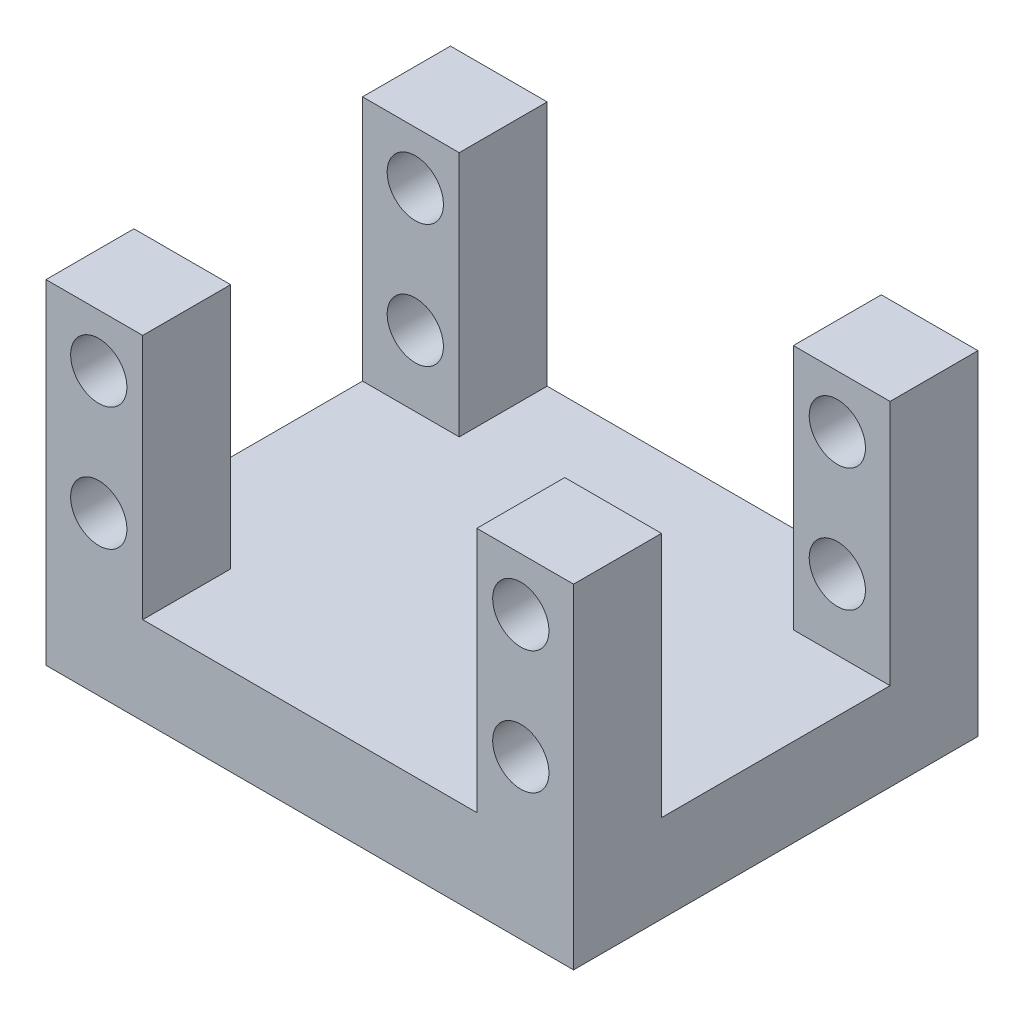
ISO-10303-21;
HEADER;
FILE_DESCRIPTION(('STEP AP214'),'2;1');
FILE_NAME('part.step','',(''),(''),'','','');
FILE_SCHEMA(('AUTOMOTIVE_DESIGN { 1 0 10303 214 1 1 1 1 }'));
ENDSEC;
DATA;
#1=APPLICATION_CONTEXT('core data for automotive mechanical design processes');
#2=APPLICATION_PROTOCOL_DEFINITION('international standard','automotive_design',2000,#1);
#3=PRODUCT_CONTEXT('',#1,'mechanical');
#4=PRODUCT('Part','Part','',(#3));
#5=PRODUCT_RELATED_PRODUCT_CATEGORY('part','',(#4));
#6=PRODUCT_DEFINITION_FORMATION('','',#4);
#7=PRODUCT_DEFINITION_CONTEXT('part definition',#1,'design');
#8=PRODUCT_DEFINITION('design','',#6,#7);
#9=PRODUCT_DEFINITION_SHAPE('','',#8);
#10=(LENGTH_UNIT() NAMED_UNIT(*) SI_UNIT(.MILLI.,.METRE.));
#11=(NAMED_UNIT(*) PLANE_ANGLE_UNIT() SI_UNIT($,.RADIAN.));
#12=(NAMED_UNIT(*) SI_UNIT($,.STERADIAN.) SOLID_ANGLE_UNIT());
#13=UNCERTAINTY_MEASURE_WITH_UNIT(LENGTH_MEASURE(1.E-05),#10,'distance_accuracy_value','');
#14=(GEOMETRIC_REPRESENTATION_CONTEXT(3) GLOBAL_UNCERTAINTY_ASSIGNED_CONTEXT((#13)) GLOBAL_UNIT_ASSIGNED_CONTEXT((#10,
#11,#12)) REPRESENTATION_CONTEXT('',''));
#15=CARTESIAN_POINT('',(0.,0.,0.));
#16=DIRECTION('',(0.,0.,1.));
#17=DIRECTION('',(1.,0.,0.));
#18=AXIS2_PLACEMENT_3D('',#15,#16,#17);
#19=CARTESIAN_POINT('',(9.50000000000002,9.5,23.));
#20=DIRECTION('',(0.,-1.,0.));
#21=DIRECTION('',(1.,0.,0.));
#22=AXIS2_PLACEMENT_3D('',#19,#20,#21);
#23=PLANE('',#22);
#24=DIRECTION('',(0.,0.,-1.));
#25=VECTOR('',#24,1.);
#26=CARTESIAN_POINT('',(9.50000000000002,9.5,23.));
#27=LINE('',#26,#25);
#28=CARTESIAN_POINT('',(9.50000000000002,9.5,5.));
#29=VERTEX_POINT('',#28);
#30=CARTESIAN_POINT('',(9.50000000000002,9.5,0.));
#31=VERTEX_POINT('',#30);
#32=EDGE_CURVE('E49',#29,#31,#27,.T.);
#33=ORIENTED_EDGE('',*,*,#32,.F.);
#34=DIRECTION('',(1.,0.,0.));
#35=VECTOR('',#34,1.);
#36=CARTESIAN_POINT('',(-15.,9.5,5.));
#37=LINE('',#36,#35);
#38=CARTESIAN_POINT('',(15.,9.5,5.));
#39=VERTEX_POINT('',#38);
#40=EDGE_CURVE('E167',#29,#39,#37,.T.);
#41=ORIENTED_EDGE('',*,*,#40,.T.);
#42=DIRECTION('',(0.,0.,-1.));
#43=VECTOR('',#42,1.);
#44=CARTESIAN_POINT('',(15.,9.5,23.));
#45=LINE('',#44,#43);
#46=CARTESIAN_POINT('',(15.,9.5,0.));
#47=VERTEX_POINT('',#46);
#48=EDGE_CURVE('E325',#39,#47,#45,.T.);
#49=ORIENTED_EDGE('',*,*,#48,.T.);
#50=DIRECTION('',(-1.,0.,0.));
#51=VECTOR('',#50,1.);
#52=CARTESIAN_POINT('',(9.50000000000002,9.5,0.));
#53=LINE('',#52,#51);
#54=EDGE_CURVE('E298',#47,#31,#53,.T.);
#55=ORIENTED_EDGE('',*,*,#54,.T.);
#56=EDGE_LOOP('',(#33,#41,#49,#55));
#57=FACE_BOUND('',#56,.T.);
#58=ADVANCED_FACE('F39',(#57),#23,.F.);
#59=CARTESIAN_POINT('',(9.50000000000002,-4.5,23.));
#60=DIRECTION('',(1.,0.,0.));
#61=DIRECTION('',(0.,0.,-1.));
#62=AXIS2_PLACEMENT_3D('',#59,#60,#61);
#63=PLANE('',#62);
#64=DIRECTION('',(0.,0.,-1.));
#65=VECTOR('',#64,1.);
#66=CARTESIAN_POINT('',(9.50000000000002,-4.5,23.));
#67=LINE('',#66,#65);
#68=CARTESIAN_POINT('',(9.50000000000001,-4.5,5.));
#69=VERTEX_POINT('',#68);
#70=CARTESIAN_POINT('',(9.50000000000002,-4.5,0.));
#71=VERTEX_POINT('',#70);
#72=EDGE_CURVE('E204',#69,#71,#67,.T.);
#73=ORIENTED_EDGE('',*,*,#72,.F.);
#74=DIRECTION('',(0.,1.,0.));
#75=VECTOR('',#74,1.);
#76=CARTESIAN_POINT('',(9.50000000000002,-4.5,5.));
#77=LINE('',#76,#75);
#78=EDGE_CURVE('E262',#69,#29,#77,.T.);
#79=ORIENTED_EDGE('',*,*,#78,.T.);
#80=ORIENTED_EDGE('',*,*,#32,.T.);
#81=DIRECTION('',(0.,-1.,0.));
#82=VECTOR('',#81,1.);
#83=CARTESIAN_POINT('',(9.50000000000002,-4.5,0.));
#84=LINE('',#83,#82);
#85=EDGE_CURVE('E329',#31,#71,#84,.T.);
#86=ORIENTED_EDGE('',*,*,#85,.T.);
#87=EDGE_LOOP('',(#73,#79,#80,#86));
#88=FACE_BOUND('',#87,.T.);
#89=ADVANCED_FACE('F401',(#88),#63,.F.);
#90=CARTESIAN_POINT('',(-9.49999999999998,-4.5,23.));
#91=DIRECTION('',(-1.,0.,0.));
#92=DIRECTION('',(0.,0.,1.));
#93=AXIS2_PLACEMENT_3D('',#90,#91,#92);
#94=PLANE('',#93);
#95=DIRECTION('',(0.,0.,-1.));
#96=VECTOR('',#95,1.);
#97=CARTESIAN_POINT('',(-9.49999999999998,9.5,23.));
#98=LINE('',#97,#96);
#99=CARTESIAN_POINT('',(-9.49999999999998,9.5,5.));
#100=VERTEX_POINT('',#99);
#101=CARTESIAN_POINT('',(-9.49999999999998,9.5,0.));
#102=VERTEX_POINT('',#101);
#103=EDGE_CURVE('E189',#100,#102,#98,.T.);
#104=ORIENTED_EDGE('',*,*,#103,.F.);
#105=DIRECTION('',(0.,-1.,0.));
#106=VECTOR('',#105,1.);
#107=CARTESIAN_POINT('',(-9.49999999999998,-4.5,5.));
#108=LINE('',#107,#106);
#109=CARTESIAN_POINT('',(-9.49999999999998,-4.5,5.));
#110=VERTEX_POINT('',#109);
#111=EDGE_CURVE('E162',#100,#110,#108,.T.);
#112=ORIENTED_EDGE('',*,*,#111,.T.);
#113=DIRECTION('',(0.,0.,-1.));
#114=VECTOR('',#113,1.);
#115=CARTESIAN_POINT('',(-9.49999999999998,-4.5,23.));
#116=LINE('',#115,#114);
#117=CARTESIAN_POINT('',(-9.49999999999998,-4.5,0.));
#118=VERTEX_POINT('',#117);
#119=EDGE_CURVE('E199',#110,#118,#116,.T.);
#120=ORIENTED_EDGE('',*,*,#119,.T.);
#121=DIRECTION('',(0.,1.,0.));
#122=VECTOR('',#121,1.);
#123=CARTESIAN_POINT('',(-9.49999999999998,-4.5,0.));
#124=LINE('',#123,#122);
#125=EDGE_CURVE('E337',#118,#102,#124,.T.);
#126=ORIENTED_EDGE('',*,*,#125,.T.);
#127=EDGE_LOOP('',(#104,#112,#120,#126));
#128=FACE_BOUND('',#127,.T.);
#129=ADVANCED_FACE('F405',(#128),#94,.F.);
#130=CARTESIAN_POINT('',(-15.,9.5,23.));
#131=DIRECTION('',(0.,-1.,0.));
#132=DIRECTION('',(0.,0.,-1.));
#133=AXIS2_PLACEMENT_3D('',#130,#131,#132);
#134=PLANE('',#133);
#135=DIRECTION('',(0.,0.,-1.));
#136=VECTOR('',#135,1.);
#137=CARTESIAN_POINT('',(-15.,9.5,23.));
#138=LINE('',#137,#136);
#139=CARTESIAN_POINT('',(-15.,9.5,5.));
#140=VERTEX_POINT('',#139);
#141=CARTESIAN_POINT('',(-15.,9.5,0.));
#142=VERTEX_POINT('',#141);
#143=EDGE_CURVE('E171',#140,#142,#138,.T.);
#144=ORIENTED_EDGE('',*,*,#143,.F.);
#145=EDGE_CURVE('E157',#140,#100,#37,.T.);
#146=ORIENTED_EDGE('',*,*,#145,.T.);
#147=ORIENTED_EDGE('',*,*,#103,.T.);
#148=DIRECTION('',(-1.,0.,0.));
#149=VECTOR('',#148,1.);
#150=CARTESIAN_POINT('',(-15.,9.5,0.));
#151=LINE('',#150,#149);
#152=EDGE_CURVE('E180',#102,#142,#151,.T.);
#153=ORIENTED_EDGE('',*,*,#152,.T.);
#154=EDGE_LOOP('',(#144,#146,#147,#153));
#155=FACE_BOUND('',#154,.T.);
#156=ADVANCED_FACE('F178',(#155),#134,.F.);
#157=CARTESIAN_POINT('',(12.,6.5,0.));
#158=DIRECTION('',(0.,0.,-1.));
#159=DIRECTION('',(-1.,0.,0.));
#160=AXIS2_PLACEMENT_3D('',#157,#158,#159);
#161=CYLINDRICAL_SURFACE('',#160,1.60000000000001);
#162=CARTESIAN_POINT('',(12.,6.5,5.));
#163=DIRECTION('',(0.,0.,-1.));
#164=DIRECTION('',(-1.,0.,0.));
#165=AXIS2_PLACEMENT_3D('',#162,#163,#164);
#166=CIRCLE('',#165,1.60000000000001);
#167=CARTESIAN_POINT('',(10.4,6.5,5.));
#168=VERTEX_POINT('',#167);
#169=EDGE_CURVE('E256',#168,#168,#166,.F.);
#170=ORIENTED_EDGE('',*,*,#169,.T.);
#171=EDGE_LOOP('',(#170));
#172=FACE_BOUND('',#171,.T.);
#173=CARTESIAN_POINT('',(12.,6.5,0.));
#174=DIRECTION('',(0.,0.,-1.));
#175=DIRECTION('',(-1.,0.,0.));
#176=AXIS2_PLACEMENT_3D('',#173,#174,#175);
#177=CIRCLE('',#176,1.60000000000001);
#178=CARTESIAN_POINT('',(10.4,6.5,0.));
#179=VERTEX_POINT('',#178);
#180=EDGE_CURVE('E290',#179,#179,#177,.T.);
#181=ORIENTED_EDGE('',*,*,#180,.T.);
#182=EDGE_LOOP('',(#181));
#183=FACE_BOUND('',#182,.T.);
#184=ADVANCED_FACE('F515',(#172,#183),#161,.F.);
#185=CARTESIAN_POINT('',(12.,-0.500000000000007,0.));
#186=DIRECTION('',(0.,0.,-1.));
#187=DIRECTION('',(-1.,0.,0.));
#188=AXIS2_PLACEMENT_3D('',#185,#186,#187);
#189=CYLINDRICAL_SURFACE('',#188,1.60000000000001);
#190=CARTESIAN_POINT('',(12.,-0.500000000000007,5.));
#191=DIRECTION('',(0.,0.,-1.));
#192=DIRECTION('',(-1.,0.,0.));
#193=AXIS2_PLACEMENT_3D('',#190,#191,#192);
#194=CIRCLE('',#193,1.60000000000001);
#195=CARTESIAN_POINT('',(10.4,-0.500000000000007,5.));
#196=VERTEX_POINT('',#195);
#197=EDGE_CURVE('E252',#196,#196,#194,.F.);
#198=ORIENTED_EDGE('',*,*,#197,.T.);
#199=EDGE_LOOP('',(#198));
#200=FACE_BOUND('',#199,.T.);
#201=CARTESIAN_POINT('',(12.,-0.500000000000007,0.));
#202=DIRECTION('',(0.,0.,-1.));
#203=DIRECTION('',(-1.,0.,0.));
#204=AXIS2_PLACEMENT_3D('',#201,#202,#203);
#205=CIRCLE('',#204,1.60000000000001);
#206=CARTESIAN_POINT('',(10.4,-0.500000000000007,0.));
#207=VERTEX_POINT('',#206);
#208=EDGE_CURVE('E282',#207,#207,#205,.T.);
#209=ORIENTED_EDGE('',*,*,#208,.T.);
#210=EDGE_LOOP('',(#209));
#211=FACE_BOUND('',#210,.T.);
#212=ADVANCED_FACE('F528',(#200,#211),#189,.F.);
#213=CARTESIAN_POINT('',(-12.,-0.500000000000007,0.));
#214=DIRECTION('',(0.,0.,-1.));
#215=DIRECTION('',(-1.,0.,0.));
#216=AXIS2_PLACEMENT_3D('',#213,#214,#215);
#217=CYLINDRICAL_SURFACE('',#216,1.60000000000001);
#218=CARTESIAN_POINT('',(-12.,-0.500000000000007,5.));
#219=DIRECTION('',(0.,0.,-1.));
#220=DIRECTION('',(-1.,0.,0.));
#221=AXIS2_PLACEMENT_3D('',#218,#219,#220);
#222=CIRCLE('',#221,1.60000000000001);
#223=CARTESIAN_POINT('',(-13.6,-0.500000000000007,5.));
#224=VERTEX_POINT('',#223);
#225=EDGE_CURVE('E248',#224,#224,#222,.F.);
#226=ORIENTED_EDGE('',*,*,#225,.T.);
#227=EDGE_LOOP('',(#226));
#228=FACE_BOUND('',#227,.T.);
#229=CARTESIAN_POINT('',(-12.,-0.500000000000007,0.));
#230=DIRECTION('',(0.,0.,-1.));
#231=DIRECTION('',(-1.,0.,0.));
#232=AXIS2_PLACEMENT_3D('',#229,#230,#231);
#233=CIRCLE('',#232,1.60000000000001);
#234=CARTESIAN_POINT('',(-13.6,-0.500000000000007,0.));
#235=VERTEX_POINT('',#234);
#236=EDGE_CURVE('E274',#235,#235,#233,.T.);
#237=ORIENTED_EDGE('',*,*,#236,.T.);
#238=EDGE_LOOP('',(#237));
#239=FACE_BOUND('',#238,.T.);
#240=ADVANCED_FACE('F416',(#228,#239),#217,.F.);
#241=CARTESIAN_POINT('',(-12.,6.5,0.));
#242=DIRECTION('',(0.,0.,-1.));
#243=DIRECTION('',(-1.,0.,0.));
#244=AXIS2_PLACEMENT_3D('',#241,#242,#243);
#245=CYLINDRICAL_SURFACE('',#244,1.60000000000001);
#246=CARTESIAN_POINT('',(-12.,6.5,5.));
#247=DIRECTION('',(0.,0.,-1.));
#248=DIRECTION('',(-1.,0.,0.));
#249=AXIS2_PLACEMENT_3D('',#246,#247,#248);
#250=CIRCLE('',#249,1.60000000000001);
#251=CARTESIAN_POINT('',(-13.6,6.5,5.));
#252=VERTEX_POINT('',#251);
#253=EDGE_CURVE('E43',#252,#252,#250,.F.);
#254=ORIENTED_EDGE('',*,*,#253,.T.);
#255=EDGE_LOOP('',(#254));
#256=FACE_BOUND('',#255,.T.);
#257=CARTESIAN_POINT('',(-12.,6.5,0.));
#258=DIRECTION('',(0.,0.,-1.));
#259=DIRECTION('',(-1.,0.,0.));
#260=AXIS2_PLACEMENT_3D('',#257,#258,#259);
#261=CIRCLE('',#260,1.60000000000001);
#262=CARTESIAN_POINT('',(-13.6,6.5,0.));
#263=VERTEX_POINT('',#262);
#264=EDGE_CURVE('E266',#263,#263,#261,.T.);
#265=ORIENTED_EDGE('',*,*,#264,.T.);
#266=EDGE_LOOP('',(#265));
#267=FACE_BOUND('',#266,.T.);
#268=ADVANCED_FACE('F381',(#256,#267),#245,.F.);
#269=CARTESIAN_POINT('',(15.,9.5,23.));
#270=VERTEX_POINT('',#269);
#271=CARTESIAN_POINT('',(15.,9.5,18.));
#272=VERTEX_POINT('',#271);
#273=EDGE_CURVE('E352',#270,#272,#45,.T.);
#274=ORIENTED_EDGE('',*,*,#273,.T.);
#275=DIRECTION('',(1.,0.,0.));
#276=VECTOR('',#275,1.);
#277=CARTESIAN_POINT('',(-15.,9.5,18.));
#278=LINE('',#277,#276);
#279=CARTESIAN_POINT('',(9.50000000000002,9.5,18.));
#280=VERTEX_POINT('',#279);
#281=EDGE_CURVE('E65',#280,#272,#278,.T.);
#282=ORIENTED_EDGE('',*,*,#281,.F.);
#283=CARTESIAN_POINT('',(9.50000000000002,9.5,23.));
#284=VERTEX_POINT('',#283);
#285=EDGE_CURVE('E11',#284,#280,#27,.T.);
#286=ORIENTED_EDGE('',*,*,#285,.F.);
#287=DIRECTION('',(-1.,0.,0.));
#288=VECTOR('',#287,1.);
#289=CARTESIAN_POINT('',(9.50000000000002,9.5,23.));
#290=LINE('',#289,#288);
#291=EDGE_CURVE('E299',#270,#284,#290,.T.);
#292=ORIENTED_EDGE('',*,*,#291,.F.);
#293=EDGE_LOOP('',(#274,#282,#286,#292));
#294=FACE_BOUND('',#293,.T.);
#295=ADVANCED_FACE('F41',(#294),#23,.F.);
#296=ORIENTED_EDGE('',*,*,#285,.T.);
#297=DIRECTION('',(0.,-1.,0.));
#298=VECTOR('',#297,1.);
#299=CARTESIAN_POINT('',(9.50000000000002,-4.5,18.));
#300=LINE('',#299,#298);
#301=CARTESIAN_POINT('',(9.50000000000001,-4.5,18.));
#302=VERTEX_POINT('',#301);
#303=EDGE_CURVE('E244',#280,#302,#300,.T.);
#304=ORIENTED_EDGE('',*,*,#303,.T.);
#305=CARTESIAN_POINT('',(9.50000000000002,-4.5,23.));
#306=VERTEX_POINT('',#305);
#307=EDGE_CURVE('E205',#306,#302,#67,.T.);
#308=ORIENTED_EDGE('',*,*,#307,.F.);
#309=DIRECTION('',(0.,-1.,0.));
#310=VECTOR('',#309,1.);
#311=CARTESIAN_POINT('',(9.50000000000002,-4.5,23.));
#312=LINE('',#311,#310);
#313=EDGE_CURVE('E303',#284,#306,#312,.T.);
#314=ORIENTED_EDGE('',*,*,#313,.F.);
#315=EDGE_LOOP('',(#296,#304,#308,#314));
#316=FACE_BOUND('',#315,.T.);
#317=ADVANCED_FACE('F407',(#316),#63,.F.);
#318=CARTESIAN_POINT('',(-9.49999999999998,-4.5,23.));
#319=DIRECTION('',(0.,-1.,0.));
#320=DIRECTION('',(0.,0.,-1.));
#321=AXIS2_PLACEMENT_3D('',#318,#319,#320);
#322=PLANE('',#321);
#323=ORIENTED_EDGE('',*,*,#307,.T.);
#324=DIRECTION('',(1.,0.,0.));
#325=VECTOR('',#324,1.);
#326=CARTESIAN_POINT('',(-15.,-4.5,18.));
#327=LINE('',#326,#325);
#328=CARTESIAN_POINT('',(15.,-4.5,18.));
#329=VERTEX_POINT('',#328);
#330=EDGE_CURVE('E229',#302,#329,#327,.T.);
#331=ORIENTED_EDGE('',*,*,#330,.T.);
#332=DIRECTION('',(0.,0.,-1.));
#333=VECTOR('',#332,1.);
#334=CARTESIAN_POINT('',(15.,-4.5,18.));
#335=LINE('',#334,#333);
#336=CARTESIAN_POINT('',(15.,-4.5,5.));
#337=VERTEX_POINT('',#336);
#338=EDGE_CURVE('E176',#329,#337,#335,.T.);
#339=ORIENTED_EDGE('',*,*,#338,.T.);
#340=DIRECTION('',(1.,0.,0.));
#341=VECTOR('',#340,1.);
#342=CARTESIAN_POINT('',(-15.,-4.5,5.));
#343=LINE('',#342,#341);
#344=EDGE_CURVE('E220',#69,#337,#343,.T.);
#345=ORIENTED_EDGE('',*,*,#344,.F.);
#346=ORIENTED_EDGE('',*,*,#72,.T.);
#347=DIRECTION('',(-1.,0.,0.));
#348=VECTOR('',#347,1.);
#349=CARTESIAN_POINT('',(-9.49999999999998,-4.5,0.));
#350=LINE('',#349,#348);
#351=EDGE_CURVE('E333',#71,#118,#350,.T.);
#352=ORIENTED_EDGE('',*,*,#351,.T.);
#353=ORIENTED_EDGE('',*,*,#119,.F.);
#354=CARTESIAN_POINT('',(-15.,-4.5,5.));
#355=VERTEX_POINT('',#354);
#356=EDGE_CURVE('E212',#355,#110,#343,.T.);
#357=ORIENTED_EDGE('',*,*,#356,.F.);
#358=DIRECTION('',(0.,0.,-1.));
#359=VECTOR('',#358,1.);
#360=CARTESIAN_POINT('',(-15.,-4.5,18.));
#361=LINE('',#360,#359);
#362=CARTESIAN_POINT('',(-15.,-4.5,18.));
#363=VERTEX_POINT('',#362);
#364=EDGE_CURVE('E57',#363,#355,#361,.T.);
#365=ORIENTED_EDGE('',*,*,#364,.F.);
#366=CARTESIAN_POINT('',(-9.49999999999998,-4.5,18.));
#367=VERTEX_POINT('',#366);
#368=EDGE_CURVE('E223',#363,#367,#327,.T.);
#369=ORIENTED_EDGE('',*,*,#368,.T.);
#370=CARTESIAN_POINT('',(-9.49999999999998,-4.5,23.));
#371=VERTEX_POINT('',#370);
#372=EDGE_CURVE('E200',#371,#367,#116,.T.);
#373=ORIENTED_EDGE('',*,*,#372,.F.);
#374=DIRECTION('',(-1.,0.,0.));
#375=VECTOR('',#374,1.);
#376=CARTESIAN_POINT('',(-9.49999999999998,-4.5,23.));
#377=LINE('',#376,#375);
#378=EDGE_CURVE('E307',#306,#371,#377,.T.);
#379=ORIENTED_EDGE('',*,*,#378,.F.);
#380=EDGE_LOOP('',(#323,#331,#339,#345,#346,#352,#353,#357,#365,#369,#373,#379));
#381=FACE_BOUND('',#380,.T.);
#382=ADVANCED_FACE('F414',(#381),#322,.F.);
#383=ORIENTED_EDGE('',*,*,#372,.T.);
#384=DIRECTION('',(0.,1.,0.));
#385=VECTOR('',#384,1.);
#386=CARTESIAN_POINT('',(-9.49999999999998,-4.5,18.));
#387=LINE('',#386,#385);
#388=CARTESIAN_POINT('',(-9.49999999999998,9.5,18.));
#389=VERTEX_POINT('',#388);
#390=EDGE_CURVE('E240',#367,#389,#387,.T.);
#391=ORIENTED_EDGE('',*,*,#390,.T.);
#392=CARTESIAN_POINT('',(-9.49999999999998,9.5,23.));
#393=VERTEX_POINT('',#392);
#394=EDGE_CURVE('E195',#393,#389,#98,.T.);
#395=ORIENTED_EDGE('',*,*,#394,.F.);
#396=DIRECTION('',(0.,1.,0.));
#397=VECTOR('',#396,1.);
#398=CARTESIAN_POINT('',(-9.49999999999998,-4.5,23.));
#399=LINE('',#398,#397);
#400=EDGE_CURVE('E310',#371,#393,#399,.T.);
#401=ORIENTED_EDGE('',*,*,#400,.F.);
#402=EDGE_LOOP('',(#383,#391,#395,#401));
#403=FACE_BOUND('',#402,.T.);
#404=ADVANCED_FACE('F441',(#403),#94,.F.);
#405=ORIENTED_EDGE('',*,*,#394,.T.);
#406=CARTESIAN_POINT('',(-15.,9.5,18.));
#407=VERTEX_POINT('',#406);
#408=EDGE_CURVE('E230',#407,#389,#278,.T.);
#409=ORIENTED_EDGE('',*,*,#408,.F.);
#410=CARTESIAN_POINT('',(-15.,9.5,23.));
#411=VERTEX_POINT('',#410);
#412=EDGE_CURVE('E183',#411,#407,#138,.T.);
#413=ORIENTED_EDGE('',*,*,#412,.F.);
#414=DIRECTION('',(-1.,0.,0.));
#415=VECTOR('',#414,1.);
#416=CARTESIAN_POINT('',(-15.,9.5,23.));
#417=LINE('',#416,#415);
#418=EDGE_CURVE('E313',#393,#411,#417,.T.);
#419=ORIENTED_EDGE('',*,*,#418,.F.);
#420=EDGE_LOOP('',(#405,#409,#413,#419));
#421=FACE_BOUND('',#420,.T.);
#422=ADVANCED_FACE('F436',(#421),#134,.F.);
#423=CARTESIAN_POINT('',(-15.,-9.5,23.));
#424=DIRECTION('',(1.,0.,0.));
#425=DIRECTION('',(0.,0.,-1.));
#426=AXIS2_PLACEMENT_3D('',#423,#424,#425);
#427=PLANE('',#426);
#428=ORIENTED_EDGE('',*,*,#364,.T.);
#429=DIRECTION('',(0.,1.,0.));
#430=VECTOR('',#429,1.);
#431=CARTESIAN_POINT('',(-15.,-4.5,5.));
#432=LINE('',#431,#430);
#433=EDGE_CURVE('E160',#355,#140,#432,.T.);
#434=ORIENTED_EDGE('',*,*,#433,.T.);
#435=ORIENTED_EDGE('',*,*,#143,.T.);
#436=DIRECTION('',(0.,-1.,0.));
#437=VECTOR('',#436,1.);
#438=CARTESIAN_POINT('',(-15.,-9.5,0.));
#439=LINE('',#438,#437);
#440=CARTESIAN_POINT('',(-15.,-9.5,0.));
#441=VERTEX_POINT('',#440);
#442=EDGE_CURVE('E343',#142,#441,#439,.T.);
#443=ORIENTED_EDGE('',*,*,#442,.T.);
#444=DIRECTION('',(0.,0.,-1.));
#445=VECTOR('',#444,1.);
#446=CARTESIAN_POINT('',(-15.,-9.5,23.));
#447=LINE('',#446,#445);
#448=CARTESIAN_POINT('',(-15.,-9.5,23.));
#449=VERTEX_POINT('',#448);
#450=EDGE_CURVE('E184',#449,#441,#447,.T.);
#451=ORIENTED_EDGE('',*,*,#450,.F.);
#452=DIRECTION('',(0.,-1.,0.));
#453=VECTOR('',#452,1.);
#454=CARTESIAN_POINT('',(-15.,-9.5,23.));
#455=LINE('',#454,#453);
#456=EDGE_CURVE('E316',#411,#449,#455,.T.);
#457=ORIENTED_EDGE('',*,*,#456,.F.);
#458=ORIENTED_EDGE('',*,*,#412,.T.);
#459=DIRECTION('',(0.,-1.,0.));
#460=VECTOR('',#459,1.);
#461=CARTESIAN_POINT('',(-15.,-4.5,18.));
#462=LINE('',#461,#460);
#463=EDGE_CURVE('E175',#407,#363,#462,.T.);
#464=ORIENTED_EDGE('',*,*,#463,.T.);
#465=EDGE_LOOP('',(#428,#434,#435,#443,#451,#457,#458,#464));
#466=FACE_BOUND('',#465,.T.);
#467=ADVANCED_FACE('F170',(#466),#427,.F.);
#468=CARTESIAN_POINT('',(-15.,-9.5,23.));
#469=DIRECTION('',(0.,1.,0.));
#470=DIRECTION('',(-1.,0.,0.));
#471=AXIS2_PLACEMENT_3D('',#468,#469,#470);
#472=PLANE('',#471);
#473=DIRECTION('',(1.,0.,0.));
#474=VECTOR('',#473,1.);
#475=CARTESIAN_POINT('',(-15.,-9.5,0.));
#476=LINE('',#475,#474);
#477=CARTESIAN_POINT('',(15.,-9.5,0.));
#478=VERTEX_POINT('',#477);
#479=EDGE_CURVE('E346',#441,#478,#476,.T.);
#480=ORIENTED_EDGE('',*,*,#479,.T.);
#481=DIRECTION('',(0.,0.,-1.));
#482=VECTOR('',#481,1.);
#483=CARTESIAN_POINT('',(15.,-9.5,23.));
#484=LINE('',#483,#482);
#485=CARTESIAN_POINT('',(15.,-9.5,23.));
#486=VERTEX_POINT('',#485);
#487=EDGE_CURVE('E191',#486,#478,#484,.T.);
#488=ORIENTED_EDGE('',*,*,#487,.F.);
#489=DIRECTION('',(1.,0.,0.));
#490=VECTOR('',#489,1.);
#491=CARTESIAN_POINT('',(-15.,-9.5,23.));
#492=LINE('',#491,#490);
#493=EDGE_CURVE('E319',#449,#486,#492,.T.);
#494=ORIENTED_EDGE('',*,*,#493,.F.);
#495=ORIENTED_EDGE('',*,*,#450,.T.);
#496=EDGE_LOOP('',(#480,#488,#494,#495));
#497=FACE_BOUND('',#496,.T.);
#498=ADVANCED_FACE('F461',(#497),#472,.F.);
#499=CARTESIAN_POINT('',(15.,-9.5,23.));
#500=DIRECTION('',(-1.,0.,0.));
#501=DIRECTION('',(0.,0.,1.));
#502=AXIS2_PLACEMENT_3D('',#499,#500,#501);
#503=PLANE('',#502);
#504=ORIENTED_EDGE('',*,*,#48,.F.);
#505=DIRECTION('',(0.,1.,0.));
#506=VECTOR('',#505,1.);
#507=CARTESIAN_POINT('',(15.,-4.5,5.));
#508=LINE('',#507,#506);
#509=EDGE_CURVE('E423',#337,#39,#508,.T.);
#510=ORIENTED_EDGE('',*,*,#509,.F.);
#511=ORIENTED_EDGE('',*,*,#338,.F.);
#512=DIRECTION('',(0.,-1.,0.));
#513=VECTOR('',#512,1.);
#514=CARTESIAN_POINT('',(15.,-4.5,18.));
#515=LINE('',#514,#513);
#516=EDGE_CURVE('E420',#272,#329,#515,.T.);
#517=ORIENTED_EDGE('',*,*,#516,.F.);
#518=ORIENTED_EDGE('',*,*,#273,.F.);
#519=DIRECTION('',(0.,1.,0.));
#520=VECTOR('',#519,1.);
#521=CARTESIAN_POINT('',(15.,-9.5,23.));
#522=LINE('',#521,#520);
#523=EDGE_CURVE('E322',#486,#270,#522,.T.);
#524=ORIENTED_EDGE('',*,*,#523,.F.);
#525=ORIENTED_EDGE('',*,*,#487,.T.);
#526=DIRECTION('',(0.,1.,0.));
#527=VECTOR('',#526,1.);
#528=CARTESIAN_POINT('',(15.,-9.5,0.));
#529=LINE('',#528,#527);
#530=EDGE_CURVE('E304',#478,#47,#529,.T.);
#531=ORIENTED_EDGE('',*,*,#530,.T.);
#532=EDGE_LOOP('',(#504,#510,#511,#517,#518,#524,#525,#531));
#533=FACE_BOUND('',#532,.T.);
#534=ADVANCED_FACE('F362',(#533),#503,.F.);
#535=CARTESIAN_POINT('',(0.,0.,23.));
#536=DIRECTION('',(0.,0.,1.));
#537=DIRECTION('',(1.,0.,0.));
#538=AXIS2_PLACEMENT_3D('',#535,#536,#537);
#539=PLANE('',#538);
#540=CARTESIAN_POINT('',(-12.,6.5,23.));
#541=DIRECTION('',(0.,0.,-1.));
#542=DIRECTION('',(-1.,0.,0.));
#543=AXIS2_PLACEMENT_3D('',#540,#541,#542);
#544=CIRCLE('',#543,1.60000000000001);
#545=CARTESIAN_POINT('',(-13.6,6.5,23.));
#546=VERTEX_POINT('',#545);
#547=EDGE_CURVE('E270',#546,#546,#544,.T.);
#548=ORIENTED_EDGE('',*,*,#547,.T.);
#549=EDGE_LOOP('',(#548));
#550=FACE_BOUND('',#549,.T.);
#551=CARTESIAN_POINT('',(-12.,-0.500000000000007,23.));
#552=DIRECTION('',(0.,0.,-1.));
#553=DIRECTION('',(-1.,0.,0.));
#554=AXIS2_PLACEMENT_3D('',#551,#552,#553);
#555=CIRCLE('',#554,1.60000000000001);
#556=CARTESIAN_POINT('',(-13.6,-0.500000000000007,23.));
#557=VERTEX_POINT('',#556);
#558=EDGE_CURVE('E278',#557,#557,#555,.T.);
#559=ORIENTED_EDGE('',*,*,#558,.T.);
#560=EDGE_LOOP('',(#559));
#561=FACE_BOUND('',#560,.T.);
#562=CARTESIAN_POINT('',(12.,-0.500000000000007,23.));
#563=DIRECTION('',(0.,0.,-1.));
#564=DIRECTION('',(-1.,0.,0.));
#565=AXIS2_PLACEMENT_3D('',#562,#563,#564);
#566=CIRCLE('',#565,1.60000000000001);
#567=CARTESIAN_POINT('',(10.4,-0.500000000000007,23.));
#568=VERTEX_POINT('',#567);
#569=EDGE_CURVE('E286',#568,#568,#566,.T.);
#570=ORIENTED_EDGE('',*,*,#569,.T.);
#571=EDGE_LOOP('',(#570));
#572=FACE_BOUND('',#571,.T.);
#573=CARTESIAN_POINT('',(12.,6.5,23.));
#574=DIRECTION('',(0.,0.,-1.));
#575=DIRECTION('',(-1.,0.,0.));
#576=AXIS2_PLACEMENT_3D('',#573,#574,#575);
#577=CIRCLE('',#576,1.60000000000001);
#578=CARTESIAN_POINT('',(10.4,6.5,23.));
#579=VERTEX_POINT('',#578);
#580=EDGE_CURVE('E294',#579,#579,#577,.T.);
#581=ORIENTED_EDGE('',*,*,#580,.T.);
#582=EDGE_LOOP('',(#581));
#583=FACE_BOUND('',#582,.T.);
#584=ORIENTED_EDGE('',*,*,#291,.T.);
#585=ORIENTED_EDGE('',*,*,#313,.T.);
#586=ORIENTED_EDGE('',*,*,#378,.T.);
#587=ORIENTED_EDGE('',*,*,#400,.T.);
#588=ORIENTED_EDGE('',*,*,#418,.T.);
#589=ORIENTED_EDGE('',*,*,#456,.T.);
#590=ORIENTED_EDGE('',*,*,#493,.T.);
#591=ORIENTED_EDGE('',*,*,#523,.T.);
#592=EDGE_LOOP('',(#584,#585,#586,#587,#588,#589,#590,#591));
#593=FACE_BOUND('',#592,.T.);
#594=ADVANCED_FACE('F446',(#550,#561,#572,#583,#593),#539,.T.);
#595=CARTESIAN_POINT('',(0.,0.,0.));
#596=DIRECTION('',(0.,0.,1.));
#597=DIRECTION('',(1.,0.,0.));
#598=AXIS2_PLACEMENT_3D('',#595,#596,#597);
#599=PLANE('',#598);
#600=ORIENTED_EDGE('',*,*,#264,.F.);
#601=EDGE_LOOP('',(#600));
#602=FACE_BOUND('',#601,.T.);
#603=ORIENTED_EDGE('',*,*,#236,.F.);
#604=EDGE_LOOP('',(#603));
#605=FACE_BOUND('',#604,.T.);
#606=ORIENTED_EDGE('',*,*,#208,.F.);
#607=EDGE_LOOP('',(#606));
#608=FACE_BOUND('',#607,.T.);
#609=ORIENTED_EDGE('',*,*,#180,.F.);
#610=EDGE_LOOP('',(#609));
#611=FACE_BOUND('',#610,.T.);
#612=ORIENTED_EDGE('',*,*,#54,.F.);
#613=ORIENTED_EDGE('',*,*,#530,.F.);
#614=ORIENTED_EDGE('',*,*,#479,.F.);
#615=ORIENTED_EDGE('',*,*,#442,.F.);
#616=ORIENTED_EDGE('',*,*,#152,.F.);
#617=ORIENTED_EDGE('',*,*,#125,.F.);
#618=ORIENTED_EDGE('',*,*,#351,.F.);
#619=ORIENTED_EDGE('',*,*,#85,.F.);
#620=EDGE_LOOP('',(#612,#613,#614,#615,#616,#617,#618,#619));
#621=FACE_BOUND('',#620,.T.);
#622=ADVANCED_FACE('F369',(#602,#605,#608,#611,#621),#599,.F.);
#623=CARTESIAN_POINT('',(12.,6.5,18.));
#624=DIRECTION('',(0.,0.,1.));
#625=DIRECTION('',(1.,0.,0.));
#626=AXIS2_PLACEMENT_3D('',#623,#624,#625);
#627=CIRCLE('',#626,1.60000000000001);
#628=CARTESIAN_POINT('',(13.6,6.5,18.));
#629=VERTEX_POINT('',#628);
#630=EDGE_CURVE('E236',#629,#629,#627,.F.);
#631=ORIENTED_EDGE('',*,*,#630,.T.);
#632=EDGE_LOOP('',(#631));
#633=FACE_BOUND('',#632,.T.);
#634=ORIENTED_EDGE('',*,*,#580,.F.);
#635=EDGE_LOOP('',(#634));
#636=FACE_BOUND('',#635,.T.);
#637=ADVANCED_FACE('F507',(#633,#636),#161,.F.);
#638=CARTESIAN_POINT('',(12.,-0.500000000000007,18.));
#639=DIRECTION('',(0.,0.,1.));
#640=DIRECTION('',(1.,0.,0.));
#641=AXIS2_PLACEMENT_3D('',#638,#639,#640);
#642=CIRCLE('',#641,1.60000000000001);
#643=CARTESIAN_POINT('',(13.6,-0.500000000000007,18.));
#644=VERTEX_POINT('',#643);
#645=EDGE_CURVE('E218',#644,#644,#642,.F.);
#646=ORIENTED_EDGE('',*,*,#645,.T.);
#647=EDGE_LOOP('',(#646));
#648=FACE_BOUND('',#647,.T.);
#649=ORIENTED_EDGE('',*,*,#569,.F.);
#650=EDGE_LOOP('',(#649));
#651=FACE_BOUND('',#650,.T.);
#652=ADVANCED_FACE('F512',(#648,#651),#189,.F.);
#653=CARTESIAN_POINT('',(-12.,-0.500000000000007,18.));
#654=DIRECTION('',(0.,0.,1.));
#655=DIRECTION('',(1.,0.,0.));
#656=AXIS2_PLACEMENT_3D('',#653,#654,#655);
#657=CIRCLE('',#656,1.60000000000001);
#658=CARTESIAN_POINT('',(-10.4,-0.500000000000007,18.));
#659=VERTEX_POINT('',#658);
#660=EDGE_CURVE('E211',#659,#659,#657,.F.);
#661=ORIENTED_EDGE('',*,*,#660,.T.);
#662=EDGE_LOOP('',(#661));
#663=FACE_BOUND('',#662,.T.);
#664=ORIENTED_EDGE('',*,*,#558,.F.);
#665=EDGE_LOOP('',(#664));
#666=FACE_BOUND('',#665,.T.);
#667=ADVANCED_FACE('F525',(#663,#666),#217,.F.);
#668=CARTESIAN_POINT('',(-12.,6.5,18.));
#669=DIRECTION('',(0.,0.,1.));
#670=DIRECTION('',(1.,0.,0.));
#671=AXIS2_PLACEMENT_3D('',#668,#669,#670);
#672=CIRCLE('',#671,1.60000000000001);
#673=CARTESIAN_POINT('',(-10.4,6.5,18.));
#674=VERTEX_POINT('',#673);
#675=EDGE_CURVE('E208',#674,#674,#672,.F.);
#676=ORIENTED_EDGE('',*,*,#675,.T.);
#677=EDGE_LOOP('',(#676));
#678=FACE_BOUND('',#677,.T.);
#679=ORIENTED_EDGE('',*,*,#547,.F.);
#680=EDGE_LOOP('',(#679));
#681=FACE_BOUND('',#680,.T.);
#682=ADVANCED_FACE('F395',(#678,#681),#245,.F.);
#683=CARTESIAN_POINT('',(-15.,-4.5,18.));
#684=DIRECTION('',(0.,0.,1.));
#685=DIRECTION('',(1.,0.,0.));
#686=AXIS2_PLACEMENT_3D('',#683,#684,#685);
#687=PLANE('',#686);
#688=ORIENTED_EDGE('',*,*,#660,.F.);
#689=EDGE_LOOP('',(#688));
#690=FACE_BOUND('',#689,.T.);
#691=ORIENTED_EDGE('',*,*,#675,.F.);
#692=EDGE_LOOP('',(#691));
#693=FACE_BOUND('',#692,.T.);
#694=ORIENTED_EDGE('',*,*,#368,.F.);
#695=ORIENTED_EDGE('',*,*,#463,.F.);
#696=ORIENTED_EDGE('',*,*,#408,.T.);
#697=ORIENTED_EDGE('',*,*,#390,.F.);
#698=EDGE_LOOP('',(#694,#695,#696,#697));
#699=FACE_BOUND('',#698,.T.);
#700=ADVANCED_FACE('F386',(#690,#693,#699),#687,.F.);
#701=CARTESIAN_POINT('',(-15.,-4.5,5.));
#702=DIRECTION('',(0.,0.,-1.));
#703=DIRECTION('',(-1.,0.,0.));
#704=AXIS2_PLACEMENT_3D('',#701,#702,#703);
#705=PLANE('',#704);
#706=ORIENTED_EDGE('',*,*,#225,.F.);
#707=EDGE_LOOP('',(#706));
#708=FACE_BOUND('',#707,.T.);
#709=ORIENTED_EDGE('',*,*,#253,.F.);
#710=EDGE_LOOP('',(#709));
#711=FACE_BOUND('',#710,.T.);
#712=ORIENTED_EDGE('',*,*,#145,.F.);
#713=ORIENTED_EDGE('',*,*,#433,.F.);
#714=ORIENTED_EDGE('',*,*,#356,.T.);
#715=ORIENTED_EDGE('',*,*,#111,.F.);
#716=EDGE_LOOP('',(#712,#713,#714,#715));
#717=FACE_BOUND('',#716,.T.);
#718=ADVANCED_FACE('F159',(#708,#711,#717),#705,.F.);
#719=ORIENTED_EDGE('',*,*,#197,.F.);
#720=EDGE_LOOP('',(#719));
#721=FACE_BOUND('',#720,.T.);
#722=ORIENTED_EDGE('',*,*,#169,.F.);
#723=EDGE_LOOP('',(#722));
#724=FACE_BOUND('',#723,.T.);
#725=ORIENTED_EDGE('',*,*,#344,.T.);
#726=ORIENTED_EDGE('',*,*,#509,.T.);
#727=ORIENTED_EDGE('',*,*,#40,.F.);
#728=ORIENTED_EDGE('',*,*,#78,.F.);
#729=EDGE_LOOP('',(#725,#726,#727,#728));
#730=FACE_BOUND('',#729,.T.);
#731=ADVANCED_FACE('F385',(#721,#724,#730),#705,.F.);
#732=ORIENTED_EDGE('',*,*,#645,.F.);
#733=EDGE_LOOP('',(#732));
#734=FACE_BOUND('',#733,.T.);
#735=ORIENTED_EDGE('',*,*,#630,.F.);
#736=EDGE_LOOP('',(#735));
#737=FACE_BOUND('',#736,.T.);
#738=ORIENTED_EDGE('',*,*,#281,.T.);
#739=ORIENTED_EDGE('',*,*,#516,.T.);
#740=ORIENTED_EDGE('',*,*,#330,.F.);
#741=ORIENTED_EDGE('',*,*,#303,.F.);
#742=EDGE_LOOP('',(#738,#739,#740,#741));
#743=FACE_BOUND('',#742,.T.);
#744=ADVANCED_FACE('F393',(#734,#737,#743),#687,.F.);
#745=CLOSED_SHELL('',(#58,#89,#129,#156,#184,#212,#240,#268,#295,#317,#382,#404,#422,#467,#498,
#534,#594,#622,#637,#652,#667,#682,#700,#718,#731,#744));
#746=MANIFOLD_SOLID_BREP('B2',#745);
#747=ADVANCED_BREP_SHAPE_REPRESENTATION('',(#18,#746),#14);
#748=SHAPE_DEFINITION_REPRESENTATION(#9,#747);
ENDSEC;
END-ISO-10303-21;
